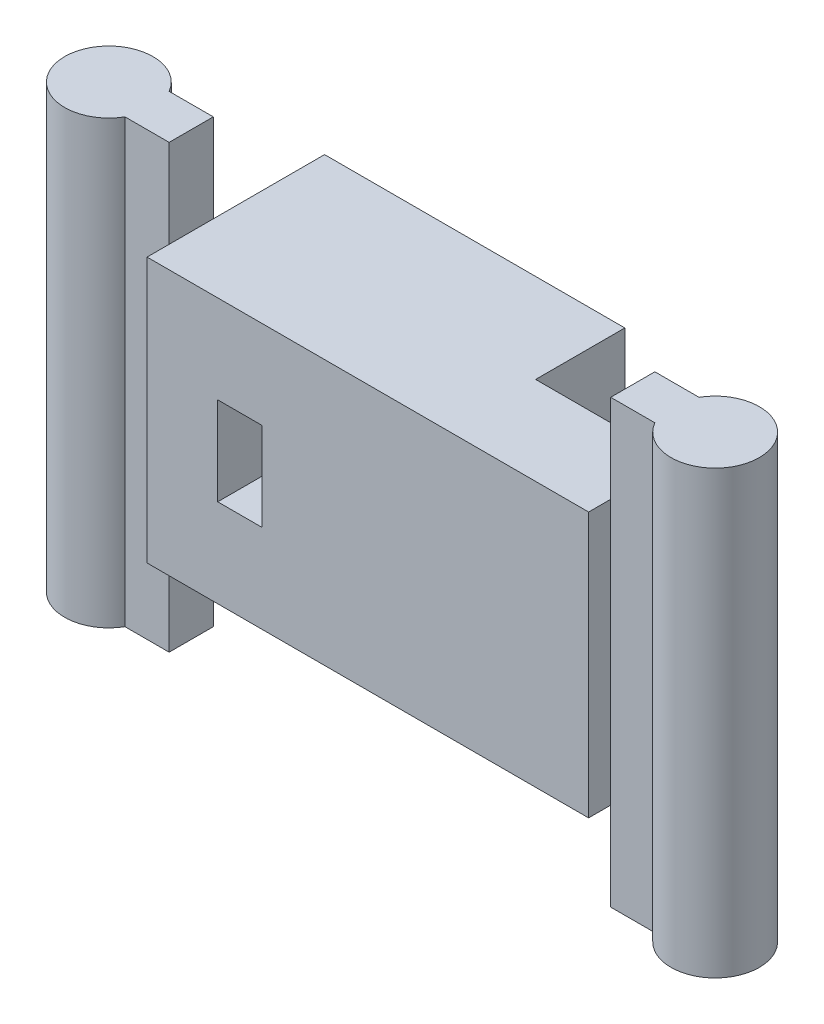
ISO-10303-21;
HEADER;
FILE_DESCRIPTION(('STEP AP214'),'2;1');
FILE_NAME('part.step','',(''),(''),'','','');
FILE_SCHEMA(('AUTOMOTIVE_DESIGN { 1 0 10303 214 1 1 1 1 }'));
ENDSEC;
DATA;
#1=APPLICATION_CONTEXT('core data for automotive mechanical design processes');
#2=APPLICATION_PROTOCOL_DEFINITION('international standard','automotive_design',2000,#1);
#3=PRODUCT_CONTEXT('',#1,'mechanical');
#4=PRODUCT('Part','Part','',(#3));
#5=PRODUCT_RELATED_PRODUCT_CATEGORY('part','',(#4));
#6=PRODUCT_DEFINITION_FORMATION('','',#4);
#7=PRODUCT_DEFINITION_CONTEXT('part definition',#1,'design');
#8=PRODUCT_DEFINITION('design','',#6,#7);
#9=PRODUCT_DEFINITION_SHAPE('','',#8);
#10=(LENGTH_UNIT() NAMED_UNIT(*) SI_UNIT(.MILLI.,.METRE.));
#11=(NAMED_UNIT(*) PLANE_ANGLE_UNIT() SI_UNIT($,.RADIAN.));
#12=(NAMED_UNIT(*) SI_UNIT($,.STERADIAN.) SOLID_ANGLE_UNIT());
#13=UNCERTAINTY_MEASURE_WITH_UNIT(LENGTH_MEASURE(1.E-05),#10,'distance_accuracy_value','');
#14=(GEOMETRIC_REPRESENTATION_CONTEXT(3) GLOBAL_UNCERTAINTY_ASSIGNED_CONTEXT((#13)) GLOBAL_UNIT_ASSIGNED_CONTEXT((#10,
#11,#12)) REPRESENTATION_CONTEXT('',''));
#15=CARTESIAN_POINT('',(0.,0.,0.));
#16=DIRECTION('',(0.,0.,1.));
#17=DIRECTION('',(1.,0.,0.));
#18=AXIS2_PLACEMENT_3D('',#15,#16,#17);
#19=CARTESIAN_POINT('',(-17.,-15.,20.1));
#20=DIRECTION('',(1.,0.,0.));
#21=DIRECTION('',(0.,0.,-1.));
#22=AXIS2_PLACEMENT_3D('',#19,#20,#21);
#23=PLANE('',#22);
#24=DIRECTION('',(0.,1.,0.));
#25=VECTOR('',#24,1.);
#26=CARTESIAN_POINT('',(-17.,-25.,17.6));
#27=LINE('',#26,#25);
#28=CARTESIAN_POINT('',(-17.,-15.,17.6));
#29=VERTEX_POINT('',#28);
#30=CARTESIAN_POINT('',(-17.,15.,17.6));
#31=VERTEX_POINT('',#30);
#32=EDGE_CURVE('E11',#29,#31,#27,.T.);
#33=ORIENTED_EDGE('',*,*,#32,.F.);
#34=DIRECTION('',(0.,0.,-1.));
#35=VECTOR('',#34,1.);
#36=CARTESIAN_POINT('',(-17.,-15.,20.1));
#37=LINE('',#36,#35);
#38=CARTESIAN_POINT('',(-17.,-15.,20.1));
#39=VERTEX_POINT('',#38);
#40=EDGE_CURVE('E345',#39,#29,#37,.T.);
#41=ORIENTED_EDGE('',*,*,#40,.F.);
#42=DIRECTION('',(0.,-1.,0.));
#43=VECTOR('',#42,1.);
#44=CARTESIAN_POINT('',(-17.,-15.,20.1));
#45=LINE('',#44,#43);
#46=CARTESIAN_POINT('',(-17.,15.,20.1));
#47=VERTEX_POINT('',#46);
#48=EDGE_CURVE('E327',#47,#39,#45,.T.);
#49=ORIENTED_EDGE('',*,*,#48,.F.);
#50=DIRECTION('',(0.,0.,-1.));
#51=VECTOR('',#50,1.);
#52=CARTESIAN_POINT('',(-17.,15.,20.1));
#53=LINE('',#52,#51);
#54=EDGE_CURVE('E349',#47,#31,#53,.T.);
#55=ORIENTED_EDGE('',*,*,#54,.T.);
#56=EDGE_LOOP('',(#33,#41,#49,#55));
#57=FACE_BOUND('',#56,.T.);
#58=ADVANCED_FACE('F37',(#57),#23,.F.);
#59=CARTESIAN_POINT('',(33.,0.,0.));
#60=DIRECTION('',(1.,0.,0.));
#61=DIRECTION('',(0.,0.,-1.));
#62=AXIS2_PLACEMENT_3D('',#59,#60,#61);
#63=PLANE('',#62);
#64=DIRECTION('',(0.,0.,-1.));
#65=VECTOR('',#64,1.);
#66=CARTESIAN_POINT('',(33.,-15.,20.1));
#67=LINE('',#66,#65);
#68=CARTESIAN_POINT('',(33.,-15.,20.1));
#69=VERTEX_POINT('',#68);
#70=CARTESIAN_POINT('',(33.,-15.,17.6));
#71=VERTEX_POINT('',#70);
#72=EDGE_CURVE('E274',#69,#71,#67,.T.);
#73=ORIENTED_EDGE('',*,*,#72,.T.);
#74=DIRECTION('',(0.,1.,0.));
#75=VECTOR('',#74,1.);
#76=CARTESIAN_POINT('',(33.,-25.,17.6));
#77=LINE('',#76,#75);
#78=CARTESIAN_POINT('',(33.,15.,17.6));
#79=VERTEX_POINT('',#78);
#80=EDGE_CURVE('E269',#71,#79,#77,.T.);
#81=ORIENTED_EDGE('',*,*,#80,.T.);
#82=DIRECTION('',(0.,0.,1.));
#83=VECTOR('',#82,1.);
#84=CARTESIAN_POINT('',(33.,15.,20.1));
#85=LINE('',#84,#83);
#86=CARTESIAN_POINT('',(33.,15.,20.1));
#87=VERTEX_POINT('',#86);
#88=EDGE_CURVE('E280',#79,#87,#85,.T.);
#89=ORIENTED_EDGE('',*,*,#88,.T.);
#90=DIRECTION('',(0.,-1.,0.));
#91=VECTOR('',#90,1.);
#92=CARTESIAN_POINT('',(33.,15.,20.1));
#93=LINE('',#92,#91);
#94=EDGE_CURVE('E270',#87,#69,#93,.T.);
#95=ORIENTED_EDGE('',*,*,#94,.T.);
#96=EDGE_LOOP('',(#73,#81,#89,#95));
#97=FACE_BOUND('',#96,.T.);
#98=ADVANCED_FACE('F426',(#97),#63,.T.);
#99=CARTESIAN_POINT('',(17.,-15.,20.1));
#100=DIRECTION('',(-1.,0.,0.));
#101=DIRECTION('',(0.,0.,1.));
#102=AXIS2_PLACEMENT_3D('',#99,#100,#101);
#103=PLANE('',#102);
#104=DIRECTION('',(0.,1.,0.));
#105=VECTOR('',#104,1.);
#106=CARTESIAN_POINT('',(17.,15.,10.1));
#107=LINE('',#106,#105);
#108=CARTESIAN_POINT('',(17.,-15.,10.1));
#109=VERTEX_POINT('',#108);
#110=CARTESIAN_POINT('',(17.,15.,10.1));
#111=VERTEX_POINT('',#110);
#112=EDGE_CURVE('E259',#109,#111,#107,.T.);
#113=ORIENTED_EDGE('',*,*,#112,.F.);
#114=DIRECTION('',(0.,0.,-1.));
#115=VECTOR('',#114,1.);
#116=CARTESIAN_POINT('',(17.,-15.,20.1));
#117=LINE('',#116,#115);
#118=CARTESIAN_POINT('',(17.,-15.,0.));
#119=VERTEX_POINT('',#118);
#120=EDGE_CURVE('E332',#109,#119,#117,.T.);
#121=ORIENTED_EDGE('',*,*,#120,.T.);
#122=DIRECTION('',(0.,1.,0.));
#123=VECTOR('',#122,1.);
#124=CARTESIAN_POINT('',(17.,-15.,0.));
#125=LINE('',#124,#123);
#126=CARTESIAN_POINT('',(17.,15.,0.));
#127=VERTEX_POINT('',#126);
#128=EDGE_CURVE('E324',#119,#127,#125,.T.);
#129=ORIENTED_EDGE('',*,*,#128,.T.);
#130=DIRECTION('',(0.,0.,-1.));
#131=VECTOR('',#130,1.);
#132=CARTESIAN_POINT('',(17.,15.,20.1));
#133=LINE('',#132,#131);
#134=EDGE_CURVE('E41',#111,#127,#133,.T.);
#135=ORIENTED_EDGE('',*,*,#134,.F.);
#136=EDGE_LOOP('',(#113,#121,#129,#135));
#137=FACE_BOUND('',#136,.T.);
#138=ADVANCED_FACE('F39',(#137),#103,.F.);
#139=CARTESIAN_POINT('',(0.,0.,20.1));
#140=DIRECTION('',(0.,0.,-1.));
#141=DIRECTION('',(-1.,0.,0.));
#142=AXIS2_PLACEMENT_3D('',#139,#140,#141);
#143=PLANE('',#142);
#144=DIRECTION('',(1.,0.,0.));
#145=VECTOR('',#144,1.);
#146=CARTESIAN_POINT('',(-17.,-15.,20.1));
#147=LINE('',#146,#145);
#148=EDGE_CURVE('E330',#39,#69,#147,.T.);
#149=ORIENTED_EDGE('',*,*,#148,.T.);
#150=ORIENTED_EDGE('',*,*,#94,.F.);
#151=DIRECTION('',(-1.,0.,0.));
#152=VECTOR('',#151,1.);
#153=CARTESIAN_POINT('',(-17.,15.,20.1));
#154=LINE('',#153,#152);
#155=EDGE_CURVE('E325',#87,#47,#154,.T.);
#156=ORIENTED_EDGE('',*,*,#155,.T.);
#157=ORIENTED_EDGE('',*,*,#48,.T.);
#158=EDGE_LOOP('',(#149,#150,#156,#157));
#159=FACE_BOUND('',#158,.T.);
#160=DIRECTION('',(0.,-1.,0.));
#161=VECTOR('',#160,1.);
#162=CARTESIAN_POINT('',(-9.,-5.,20.1));
#163=LINE('',#162,#161);
#164=CARTESIAN_POINT('',(-9.,5.,20.1));
#165=VERTEX_POINT('',#164);
#166=CARTESIAN_POINT('',(-9.,-5.,20.1));
#167=VERTEX_POINT('',#166);
#168=EDGE_CURVE('E294',#165,#167,#163,.T.);
#169=ORIENTED_EDGE('',*,*,#168,.F.);
#170=DIRECTION('',(-1.,0.,0.));
#171=VECTOR('',#170,1.);
#172=CARTESIAN_POINT('',(-4.,5.,20.1));
#173=LINE('',#172,#171);
#174=CARTESIAN_POINT('',(-4.,5.,20.1));
#175=VERTEX_POINT('',#174);
#176=EDGE_CURVE('E302',#175,#165,#173,.T.);
#177=ORIENTED_EDGE('',*,*,#176,.F.);
#178=DIRECTION('',(0.,1.,0.));
#179=VECTOR('',#178,1.);
#180=CARTESIAN_POINT('',(-4.,-5.,20.1));
#181=LINE('',#180,#179);
#182=CARTESIAN_POINT('',(-4.,-5.,20.1));
#183=VERTEX_POINT('',#182);
#184=EDGE_CURVE('E299',#183,#175,#181,.T.);
#185=ORIENTED_EDGE('',*,*,#184,.F.);
#186=DIRECTION('',(1.,0.,0.));
#187=VECTOR('',#186,1.);
#188=CARTESIAN_POINT('',(-4.,-5.,20.1));
#189=LINE('',#188,#187);
#190=EDGE_CURVE('E296',#167,#183,#189,.T.);
#191=ORIENTED_EDGE('',*,*,#190,.F.);
#192=EDGE_LOOP('',(#169,#177,#185,#191));
#193=FACE_BOUND('',#192,.T.);
#194=ADVANCED_FACE('F384',(#159,#193),#143,.F.);
#195=CARTESIAN_POINT('',(0.,0.,0.));
#196=DIRECTION('',(0.,0.,-1.));
#197=DIRECTION('',(-1.,0.,0.));
#198=AXIS2_PLACEMENT_3D('',#195,#196,#197);
#199=PLANE('',#198);
#200=ORIENTED_EDGE('',*,*,#128,.F.);
#201=DIRECTION('',(1.,0.,0.));
#202=VECTOR('',#201,1.);
#203=CARTESIAN_POINT('',(-17.,-15.,0.));
#204=LINE('',#203,#202);
#205=CARTESIAN_POINT('',(-17.,-15.,0.));
#206=VERTEX_POINT('',#205);
#207=EDGE_CURVE('E328',#206,#119,#204,.T.);
#208=ORIENTED_EDGE('',*,*,#207,.F.);
#209=DIRECTION('',(0.,-1.,0.));
#210=VECTOR('',#209,1.);
#211=CARTESIAN_POINT('',(-17.,-15.,0.));
#212=LINE('',#211,#210);
#213=CARTESIAN_POINT('',(-17.,15.,0.));
#214=VERTEX_POINT('',#213);
#215=EDGE_CURVE('E338',#214,#206,#212,.T.);
#216=ORIENTED_EDGE('',*,*,#215,.F.);
#217=DIRECTION('',(-1.,0.,0.));
#218=VECTOR('',#217,1.);
#219=CARTESIAN_POINT('',(-17.,15.,0.));
#220=LINE('',#219,#218);
#221=EDGE_CURVE('E335',#127,#214,#220,.T.);
#222=ORIENTED_EDGE('',*,*,#221,.F.);
#223=EDGE_LOOP('',(#200,#208,#216,#222));
#224=FACE_BOUND('',#223,.T.);
#225=DIRECTION('',(-1.,0.,0.));
#226=VECTOR('',#225,1.);
#227=CARTESIAN_POINT('',(-4.,5.,0.));
#228=LINE('',#227,#226);
#229=CARTESIAN_POINT('',(-4.,5.,0.));
#230=VERTEX_POINT('',#229);
#231=CARTESIAN_POINT('',(-9.,5.,0.));
#232=VERTEX_POINT('',#231);
#233=EDGE_CURVE('E297',#230,#232,#228,.T.);
#234=ORIENTED_EDGE('',*,*,#233,.T.);
#235=DIRECTION('',(0.,-1.,0.));
#236=VECTOR('',#235,1.);
#237=CARTESIAN_POINT('',(-9.,-5.,0.));
#238=LINE('',#237,#236);
#239=CARTESIAN_POINT('',(-9.,-5.,0.));
#240=VERTEX_POINT('',#239);
#241=EDGE_CURVE('E293',#232,#240,#238,.T.);
#242=ORIENTED_EDGE('',*,*,#241,.T.);
#243=DIRECTION('',(1.,0.,0.));
#244=VECTOR('',#243,1.);
#245=CARTESIAN_POINT('',(-4.,-5.,0.));
#246=LINE('',#245,#244);
#247=CARTESIAN_POINT('',(-4.,-5.,0.));
#248=VERTEX_POINT('',#247);
#249=EDGE_CURVE('E307',#240,#248,#246,.T.);
#250=ORIENTED_EDGE('',*,*,#249,.T.);
#251=DIRECTION('',(0.,1.,0.));
#252=VECTOR('',#251,1.);
#253=CARTESIAN_POINT('',(-4.,-5.,0.));
#254=LINE('',#253,#252);
#255=EDGE_CURVE('E310',#248,#230,#254,.T.);
#256=ORIENTED_EDGE('',*,*,#255,.T.);
#257=EDGE_LOOP('',(#234,#242,#250,#256));
#258=FACE_BOUND('',#257,.T.);
#259=ADVANCED_FACE('F369',(#224,#258),#199,.T.);
#260=CARTESIAN_POINT('',(-17.,15.,20.1));
#261=DIRECTION('',(0.,-1.,0.));
#262=DIRECTION('',(0.,0.,-1.));
#263=AXIS2_PLACEMENT_3D('',#260,#261,#262);
#264=PLANE('',#263);
#265=ORIENTED_EDGE('',*,*,#221,.T.);
#266=CARTESIAN_POINT('',(-17.,15.,12.6));
#267=VERTEX_POINT('',#266);
#268=EDGE_CURVE('E347',#267,#214,#53,.T.);
#269=ORIENTED_EDGE('',*,*,#268,.F.);
#270=EDGE_CURVE('E351',#31,#267,#53,.T.);
#271=ORIENTED_EDGE('',*,*,#270,.F.);
#272=ORIENTED_EDGE('',*,*,#54,.F.);
#273=ORIENTED_EDGE('',*,*,#155,.F.);
#274=ORIENTED_EDGE('',*,*,#88,.F.);
#275=CARTESIAN_POINT('',(33.,15.,12.6));
#276=VERTEX_POINT('',#275);
#277=EDGE_CURVE('E285',#276,#79,#85,.T.);
#278=ORIENTED_EDGE('',*,*,#277,.F.);
#279=CARTESIAN_POINT('',(33.,15.,10.1));
#280=VERTEX_POINT('',#279);
#281=EDGE_CURVE('E281',#280,#276,#85,.T.);
#282=ORIENTED_EDGE('',*,*,#281,.F.);
#283=DIRECTION('',(-1.,0.,0.));
#284=VECTOR('',#283,1.);
#285=CARTESIAN_POINT('',(33.,15.,10.1));
#286=LINE('',#285,#284);
#287=EDGE_CURVE('E284',#280,#111,#286,.T.);
#288=ORIENTED_EDGE('',*,*,#287,.T.);
#289=ORIENTED_EDGE('',*,*,#134,.T.);
#290=EDGE_LOOP('',(#265,#269,#271,#272,#273,#274,#278,#282,#288,#289));
#291=FACE_BOUND('',#290,.T.);
#292=ADVANCED_FACE('F366',(#291),#264,.F.);
#293=CARTESIAN_POINT('',(-17.,-15.,12.6));
#294=VERTEX_POINT('',#293);
#295=EDGE_CURVE('E344',#294,#206,#37,.T.);
#296=ORIENTED_EDGE('',*,*,#295,.F.);
#297=DIRECTION('',(0.,1.,0.));
#298=VECTOR('',#297,1.);
#299=CARTESIAN_POINT('',(-17.,-25.,12.6));
#300=LINE('',#299,#298);
#301=EDGE_CURVE('E46',#294,#267,#300,.T.);
#302=ORIENTED_EDGE('',*,*,#301,.T.);
#303=ORIENTED_EDGE('',*,*,#268,.T.);
#304=ORIENTED_EDGE('',*,*,#215,.T.);
#305=EDGE_LOOP('',(#296,#302,#303,#304));
#306=FACE_BOUND('',#305,.T.);
#307=ADVANCED_FACE('F360',(#306),#23,.F.);
#308=CARTESIAN_POINT('',(-17.,-15.,20.1));
#309=DIRECTION('',(0.,1.,0.));
#310=DIRECTION('',(0.,0.,1.));
#311=AXIS2_PLACEMENT_3D('',#308,#309,#310);
#312=PLANE('',#311);
#313=ORIENTED_EDGE('',*,*,#207,.T.);
#314=ORIENTED_EDGE('',*,*,#120,.F.);
#315=DIRECTION('',(-1.,0.,0.));
#316=VECTOR('',#315,1.);
#317=CARTESIAN_POINT('',(33.,-15.,10.1));
#318=LINE('',#317,#316);
#319=CARTESIAN_POINT('',(33.,-15.,10.1));
#320=VERTEX_POINT('',#319);
#321=EDGE_CURVE('E290',#320,#109,#318,.T.);
#322=ORIENTED_EDGE('',*,*,#321,.F.);
#323=CARTESIAN_POINT('',(33.,-15.,12.6));
#324=VERTEX_POINT('',#323);
#325=EDGE_CURVE('E273',#324,#320,#67,.T.);
#326=ORIENTED_EDGE('',*,*,#325,.F.);
#327=EDGE_CURVE('E278',#71,#324,#67,.T.);
#328=ORIENTED_EDGE('',*,*,#327,.F.);
#329=ORIENTED_EDGE('',*,*,#72,.F.);
#330=ORIENTED_EDGE('',*,*,#148,.F.);
#331=ORIENTED_EDGE('',*,*,#40,.T.);
#332=EDGE_CURVE('E348',#29,#294,#37,.T.);
#333=ORIENTED_EDGE('',*,*,#332,.T.);
#334=ORIENTED_EDGE('',*,*,#295,.T.);
#335=EDGE_LOOP('',(#313,#314,#322,#326,#328,#329,#330,#331,#333,#334));
#336=FACE_BOUND('',#335,.T.);
#337=ADVANCED_FACE('F373',(#336),#312,.F.);
#338=CARTESIAN_POINT('',(-9.,-5.,20.1));
#339=DIRECTION('',(1.,0.,0.));
#340=DIRECTION('',(0.,0.,-1.));
#341=AXIS2_PLACEMENT_3D('',#338,#339,#340);
#342=PLANE('',#341);
#343=ORIENTED_EDGE('',*,*,#241,.F.);
#344=DIRECTION('',(0.,0.,-1.));
#345=VECTOR('',#344,1.);
#346=CARTESIAN_POINT('',(-9.,5.,20.1));
#347=LINE('',#346,#345);
#348=EDGE_CURVE('E304',#165,#232,#347,.T.);
#349=ORIENTED_EDGE('',*,*,#348,.F.);
#350=ORIENTED_EDGE('',*,*,#168,.T.);
#351=DIRECTION('',(0.,0.,-1.));
#352=VECTOR('',#351,1.);
#353=CARTESIAN_POINT('',(-9.,-5.,20.1));
#354=LINE('',#353,#352);
#355=EDGE_CURVE('E321',#167,#240,#354,.T.);
#356=ORIENTED_EDGE('',*,*,#355,.T.);
#357=EDGE_LOOP('',(#343,#349,#350,#356));
#358=FACE_BOUND('',#357,.T.);
#359=ADVANCED_FACE('F449',(#358),#342,.T.);
#360=CARTESIAN_POINT('',(-4.,-5.,20.1));
#361=DIRECTION('',(0.,1.,0.));
#362=DIRECTION('',(0.,0.,1.));
#363=AXIS2_PLACEMENT_3D('',#360,#361,#362);
#364=PLANE('',#363);
#365=ORIENTED_EDGE('',*,*,#249,.F.);
#366=ORIENTED_EDGE('',*,*,#355,.F.);
#367=ORIENTED_EDGE('',*,*,#190,.T.);
#368=DIRECTION('',(0.,0.,-1.));
#369=VECTOR('',#368,1.);
#370=CARTESIAN_POINT('',(-4.,-5.,20.1));
#371=LINE('',#370,#369);
#372=EDGE_CURVE('E319',#183,#248,#371,.T.);
#373=ORIENTED_EDGE('',*,*,#372,.T.);
#374=EDGE_LOOP('',(#365,#366,#367,#373));
#375=FACE_BOUND('',#374,.T.);
#376=ADVANCED_FACE('F461',(#375),#364,.T.);
#377=CARTESIAN_POINT('',(-4.,-5.,20.1));
#378=DIRECTION('',(-1.,0.,0.));
#379=DIRECTION('',(0.,0.,1.));
#380=AXIS2_PLACEMENT_3D('',#377,#378,#379);
#381=PLANE('',#380);
#382=ORIENTED_EDGE('',*,*,#255,.F.);
#383=ORIENTED_EDGE('',*,*,#372,.F.);
#384=ORIENTED_EDGE('',*,*,#184,.T.);
#385=DIRECTION('',(0.,0.,-1.));
#386=VECTOR('',#385,1.);
#387=CARTESIAN_POINT('',(-4.,5.,20.1));
#388=LINE('',#387,#386);
#389=EDGE_CURVE('E317',#175,#230,#388,.T.);
#390=ORIENTED_EDGE('',*,*,#389,.T.);
#391=EDGE_LOOP('',(#382,#383,#384,#390));
#392=FACE_BOUND('',#391,.T.);
#393=ADVANCED_FACE('F465',(#392),#381,.T.);
#394=CARTESIAN_POINT('',(-4.,5.,20.1));
#395=DIRECTION('',(0.,-1.,0.));
#396=DIRECTION('',(0.,0.,-1.));
#397=AXIS2_PLACEMENT_3D('',#394,#395,#396);
#398=PLANE('',#397);
#399=ORIENTED_EDGE('',*,*,#233,.F.);
#400=ORIENTED_EDGE('',*,*,#389,.F.);
#401=ORIENTED_EDGE('',*,*,#176,.T.);
#402=ORIENTED_EDGE('',*,*,#348,.T.);
#403=EDGE_LOOP('',(#399,#400,#401,#402));
#404=FACE_BOUND('',#403,.T.);
#405=ADVANCED_FACE('F469',(#404),#398,.T.);
#406=CARTESIAN_POINT('',(33.,15.,10.1));
#407=DIRECTION('',(0.,0.,1.));
#408=DIRECTION('',(0.,-1.,0.));
#409=AXIS2_PLACEMENT_3D('',#406,#407,#408);
#410=PLANE('',#409);
#411=ORIENTED_EDGE('',*,*,#112,.T.);
#412=ORIENTED_EDGE('',*,*,#287,.F.);
#413=DIRECTION('',(0.,1.,0.));
#414=VECTOR('',#413,1.);
#415=CARTESIAN_POINT('',(33.,15.,10.1));
#416=LINE('',#415,#414);
#417=EDGE_CURVE('E277',#320,#280,#416,.T.);
#418=ORIENTED_EDGE('',*,*,#417,.F.);
#419=ORIENTED_EDGE('',*,*,#321,.T.);
#420=EDGE_LOOP('',(#411,#412,#418,#419));
#421=FACE_BOUND('',#420,.T.);
#422=ADVANCED_FACE('F423',(#421),#410,.F.);
#423=DIRECTION('',(0.,1.,0.));
#424=VECTOR('',#423,1.);
#425=CARTESIAN_POINT('',(33.,-25.,12.6));
#426=LINE('',#425,#424);
#427=EDGE_CURVE('E261',#324,#276,#426,.T.);
#428=ORIENTED_EDGE('',*,*,#427,.F.);
#429=ORIENTED_EDGE('',*,*,#325,.T.);
#430=ORIENTED_EDGE('',*,*,#417,.T.);
#431=ORIENTED_EDGE('',*,*,#281,.T.);
#432=EDGE_LOOP('',(#428,#429,#430,#431));
#433=FACE_BOUND('',#432,.T.);
#434=ADVANCED_FACE('F419',(#433),#63,.T.);
#435=CARTESIAN_POINT('',(33.,-25.,12.6));
#436=DIRECTION('',(-1.,0.,0.));
#437=DIRECTION('',(0.,0.,1.));
#438=AXIS2_PLACEMENT_3D('',#435,#436,#437);
#439=PLANE('',#438);
#440=CARTESIAN_POINT('',(33.,-25.,17.6));
#441=VERTEX_POINT('',#440);
#442=EDGE_CURVE('E266',#441,#71,#77,.T.);
#443=ORIENTED_EDGE('',*,*,#442,.T.);
#444=ORIENTED_EDGE('',*,*,#327,.T.);
#445=CARTESIAN_POINT('',(33.,-25.,12.6));
#446=VERTEX_POINT('',#445);
#447=EDGE_CURVE('E256',#446,#324,#426,.T.);
#448=ORIENTED_EDGE('',*,*,#447,.F.);
#449=DIRECTION('',(0.,0.,1.));
#450=VECTOR('',#449,1.);
#451=CARTESIAN_POINT('',(33.,-25.,12.6));
#452=LINE('',#451,#450);
#453=EDGE_CURVE('E233',#446,#441,#452,.T.);
#454=ORIENTED_EDGE('',*,*,#453,.T.);
#455=EDGE_LOOP('',(#443,#444,#448,#454));
#456=FACE_BOUND('',#455,.T.);
#457=ADVANCED_FACE('F416',(#456),#439,.T.);
#458=CARTESIAN_POINT('',(33.,25.,12.6));
#459=VERTEX_POINT('',#458);
#460=EDGE_CURVE('E260',#276,#459,#426,.T.);
#461=ORIENTED_EDGE('',*,*,#460,.F.);
#462=ORIENTED_EDGE('',*,*,#277,.T.);
#463=CARTESIAN_POINT('',(33.,25.,17.6));
#464=VERTEX_POINT('',#463);
#465=EDGE_CURVE('E64',#79,#464,#77,.T.);
#466=ORIENTED_EDGE('',*,*,#465,.T.);
#467=DIRECTION('',(0.,0.,1.));
#468=VECTOR('',#467,1.);
#469=CARTESIAN_POINT('',(33.,25.,12.6));
#470=LINE('',#469,#468);
#471=EDGE_CURVE('E229',#459,#464,#470,.T.);
#472=ORIENTED_EDGE('',*,*,#471,.F.);
#473=EDGE_LOOP('',(#461,#462,#466,#472));
#474=FACE_BOUND('',#473,.T.);
#475=ADVANCED_FACE('F403',(#474),#439,.T.);
#476=CARTESIAN_POINT('',(33.,-25.,12.6));
#477=DIRECTION('',(0.,0.,-1.));
#478=DIRECTION('',(-1.,0.,0.));
#479=AXIS2_PLACEMENT_3D('',#476,#477,#478);
#480=PLANE('',#479);
#481=DIRECTION('',(-1.,0.,0.));
#482=VECTOR('',#481,1.);
#483=CARTESIAN_POINT('',(33.,25.,12.6));
#484=LINE('',#483,#482);
#485=CARTESIAN_POINT('',(38.,25.,12.6));
#486=VERTEX_POINT('',#485);
#487=EDGE_CURVE('E237',#486,#459,#484,.T.);
#488=ORIENTED_EDGE('',*,*,#487,.F.);
#489=DIRECTION('',(0.,1.,0.));
#490=VECTOR('',#489,1.);
#491=CARTESIAN_POINT('',(38.,-25.,12.6));
#492=LINE('',#491,#490);
#493=CARTESIAN_POINT('',(38.,-25.,12.6));
#494=VERTEX_POINT('',#493);
#495=EDGE_CURVE('E262',#494,#486,#492,.T.);
#496=ORIENTED_EDGE('',*,*,#495,.F.);
#497=DIRECTION('',(-1.,0.,0.));
#498=VECTOR('',#497,1.);
#499=CARTESIAN_POINT('',(33.,-25.,12.6));
#500=LINE('',#499,#498);
#501=EDGE_CURVE('E243',#494,#446,#500,.T.);
#502=ORIENTED_EDGE('',*,*,#501,.T.);
#503=ORIENTED_EDGE('',*,*,#447,.T.);
#504=ORIENTED_EDGE('',*,*,#427,.T.);
#505=ORIENTED_EDGE('',*,*,#460,.T.);
#506=EDGE_LOOP('',(#488,#496,#502,#503,#504,#505));
#507=FACE_BOUND('',#506,.T.);
#508=ADVANCED_FACE('F401',(#507),#480,.T.);
#509=CARTESIAN_POINT('',(42.3301270189222,-25.,15.1));
#510=DIRECTION('',(0.,1.,0.));
#511=DIRECTION('',(0.,0.,1.));
#512=AXIS2_PLACEMENT_3D('',#509,#510,#511);
#513=CYLINDRICAL_SURFACE('',#512,5.);
#514=CARTESIAN_POINT('',(42.3301270189222,25.,15.1));
#515=DIRECTION('',(0.,1.,0.));
#516=DIRECTION('',(0.,0.,1.));
#517=AXIS2_PLACEMENT_3D('',#514,#515,#516);
#518=CIRCLE('',#517,5.);
#519=CARTESIAN_POINT('',(38.,25.,17.6));
#520=VERTEX_POINT('',#519);
#521=EDGE_CURVE('E251',#520,#486,#518,.T.);
#522=ORIENTED_EDGE('',*,*,#521,.F.);
#523=DIRECTION('',(0.,1.,0.));
#524=VECTOR('',#523,1.);
#525=CARTESIAN_POINT('',(38.,-25.,17.6));
#526=LINE('',#525,#524);
#527=CARTESIAN_POINT('',(38.,-25.,17.6));
#528=VERTEX_POINT('',#527);
#529=EDGE_CURVE('E264',#528,#520,#526,.T.);
#530=ORIENTED_EDGE('',*,*,#529,.F.);
#531=CARTESIAN_POINT('',(42.3301270189222,-25.,15.1));
#532=DIRECTION('',(0.,1.,0.));
#533=DIRECTION('',(0.,0.,1.));
#534=AXIS2_PLACEMENT_3D('',#531,#532,#533);
#535=CIRCLE('',#534,5.);
#536=EDGE_CURVE('E240',#528,#494,#535,.T.);
#537=ORIENTED_EDGE('',*,*,#536,.T.);
#538=ORIENTED_EDGE('',*,*,#495,.T.);
#539=EDGE_LOOP('',(#522,#530,#537,#538));
#540=FACE_BOUND('',#539,.T.);
#541=ADVANCED_FACE('F408',(#540),#513,.T.);
#542=CARTESIAN_POINT('',(33.,-25.,17.6));
#543=DIRECTION('',(0.,0.,1.));
#544=DIRECTION('',(1.,0.,0.));
#545=AXIS2_PLACEMENT_3D('',#542,#543,#544);
#546=PLANE('',#545);
#547=DIRECTION('',(1.,0.,0.));
#548=VECTOR('',#547,1.);
#549=CARTESIAN_POINT('',(33.,25.,17.6));
#550=LINE('',#549,#548);
#551=EDGE_CURVE('E248',#464,#520,#550,.T.);
#552=ORIENTED_EDGE('',*,*,#551,.F.);
#553=ORIENTED_EDGE('',*,*,#465,.F.);
#554=ORIENTED_EDGE('',*,*,#80,.F.);
#555=ORIENTED_EDGE('',*,*,#442,.F.);
#556=DIRECTION('',(1.,0.,0.));
#557=VECTOR('',#556,1.);
#558=CARTESIAN_POINT('',(33.,-25.,17.6));
#559=LINE('',#558,#557);
#560=EDGE_CURVE('E236',#441,#528,#559,.T.);
#561=ORIENTED_EDGE('',*,*,#560,.T.);
#562=ORIENTED_EDGE('',*,*,#529,.T.);
#563=EDGE_LOOP('',(#552,#553,#554,#555,#561,#562));
#564=FACE_BOUND('',#563,.T.);
#565=ADVANCED_FACE('F427',(#564),#546,.T.);
#566=CARTESIAN_POINT('',(42.3301270189222,-25.,15.1));
#567=DIRECTION('',(0.,1.,0.));
#568=DIRECTION('',(0.,0.,1.));
#569=AXIS2_PLACEMENT_3D('',#566,#567,#568);
#570=PLANE('',#569);
#571=ORIENTED_EDGE('',*,*,#453,.F.);
#572=ORIENTED_EDGE('',*,*,#501,.F.);
#573=ORIENTED_EDGE('',*,*,#536,.F.);
#574=ORIENTED_EDGE('',*,*,#560,.F.);
#575=EDGE_LOOP('',(#571,#572,#573,#574));
#576=FACE_BOUND('',#575,.T.);
#577=ADVANCED_FACE('F413',(#576),#570,.F.);
#578=CARTESIAN_POINT('',(42.3301270189222,25.,15.1));
#579=DIRECTION('',(0.,1.,0.));
#580=DIRECTION('',(0.,0.,1.));
#581=AXIS2_PLACEMENT_3D('',#578,#579,#580);
#582=PLANE('',#581);
#583=ORIENTED_EDGE('',*,*,#471,.T.);
#584=ORIENTED_EDGE('',*,*,#551,.T.);
#585=ORIENTED_EDGE('',*,*,#521,.T.);
#586=ORIENTED_EDGE('',*,*,#487,.T.);
#587=EDGE_LOOP('',(#583,#584,#585,#586));
#588=FACE_BOUND('',#587,.T.);
#589=ADVANCED_FACE('F405',(#588),#582,.T.);
#590=CARTESIAN_POINT('',(-17.,-25.,12.6));
#591=DIRECTION('',(1.,0.,0.));
#592=DIRECTION('',(0.,0.,-1.));
#593=AXIS2_PLACEMENT_3D('',#590,#591,#592);
#594=PLANE('',#593);
#595=ORIENTED_EDGE('',*,*,#332,.F.);
#596=CARTESIAN_POINT('',(-17.,-25.,17.6));
#597=VERTEX_POINT('',#596);
#598=EDGE_CURVE('E48',#597,#29,#27,.T.);
#599=ORIENTED_EDGE('',*,*,#598,.F.);
#600=DIRECTION('',(0.,0.,-1.));
#601=VECTOR('',#600,1.);
#602=CARTESIAN_POINT('',(-17.,-25.,12.6));
#603=LINE('',#602,#601);
#604=CARTESIAN_POINT('',(-17.,-25.,12.6));
#605=VERTEX_POINT('',#604);
#606=EDGE_CURVE('E211',#597,#605,#603,.T.);
#607=ORIENTED_EDGE('',*,*,#606,.T.);
#608=EDGE_CURVE('E230',#605,#294,#300,.T.);
#609=ORIENTED_EDGE('',*,*,#608,.T.);
#610=EDGE_LOOP('',(#595,#599,#607,#609));
#611=FACE_BOUND('',#610,.T.);
#612=ADVANCED_FACE('F379',(#611),#594,.T.);
#613=CARTESIAN_POINT('',(-26.3301270189222,-25.,15.1));
#614=DIRECTION('',(0.,1.,0.));
#615=DIRECTION('',(0.,0.,1.));
#616=AXIS2_PLACEMENT_3D('',#613,#614,#615);
#617=CYLINDRICAL_SURFACE('',#616,5.);
#618=CARTESIAN_POINT('',(-26.3301270189222,25.,15.1));
#619=DIRECTION('',(0.,1.,0.));
#620=DIRECTION('',(0.,0.,-1.));
#621=AXIS2_PLACEMENT_3D('',#618,#619,#620);
#622=CIRCLE('',#621,5.);
#623=CARTESIAN_POINT('',(-22.,25.,12.6));
#624=VERTEX_POINT('',#623);
#625=CARTESIAN_POINT('',(-22.,25.,17.6));
#626=VERTEX_POINT('',#625);
#627=EDGE_CURVE('E223',#624,#626,#622,.T.);
#628=ORIENTED_EDGE('',*,*,#627,.F.);
#629=DIRECTION('',(0.,1.,0.));
#630=VECTOR('',#629,1.);
#631=CARTESIAN_POINT('',(-22.,-25.,12.6));
#632=LINE('',#631,#630);
#633=CARTESIAN_POINT('',(-22.,-25.,12.6));
#634=VERTEX_POINT('',#633);
#635=EDGE_CURVE('E214',#634,#624,#632,.T.);
#636=ORIENTED_EDGE('',*,*,#635,.F.);
#637=CARTESIAN_POINT('',(-26.3301270189222,-25.,15.1));
#638=DIRECTION('',(0.,1.,0.));
#639=DIRECTION('',(0.,0.,-1.));
#640=AXIS2_PLACEMENT_3D('',#637,#638,#639);
#641=CIRCLE('',#640,5.);
#642=CARTESIAN_POINT('',(-22.,-25.,17.6));
#643=VERTEX_POINT('',#642);
#644=EDGE_CURVE('E208',#634,#643,#641,.T.);
#645=ORIENTED_EDGE('',*,*,#644,.T.);
#646=DIRECTION('',(0.,1.,0.));
#647=VECTOR('',#646,1.);
#648=CARTESIAN_POINT('',(-22.,-25.,17.6));
#649=LINE('',#648,#647);
#650=EDGE_CURVE('E190',#643,#626,#649,.T.);
#651=ORIENTED_EDGE('',*,*,#650,.T.);
#652=EDGE_LOOP('',(#628,#636,#645,#651));
#653=FACE_BOUND('',#652,.T.);
#654=ADVANCED_FACE('F213',(#653),#617,.T.);
#655=CARTESIAN_POINT('',(-17.,-25.,12.6));
#656=DIRECTION('',(0.,0.,-1.));
#657=DIRECTION('',(-1.,0.,0.));
#658=AXIS2_PLACEMENT_3D('',#655,#656,#657);
#659=PLANE('',#658);
#660=DIRECTION('',(-1.,0.,0.));
#661=VECTOR('',#660,1.);
#662=CARTESIAN_POINT('',(-17.,25.,12.6));
#663=LINE('',#662,#661);
#664=CARTESIAN_POINT('',(-17.,25.,12.6));
#665=VERTEX_POINT('',#664);
#666=EDGE_CURVE('E215',#665,#624,#663,.T.);
#667=ORIENTED_EDGE('',*,*,#666,.F.);
#668=EDGE_CURVE('E56',#267,#665,#300,.T.);
#669=ORIENTED_EDGE('',*,*,#668,.F.);
#670=ORIENTED_EDGE('',*,*,#301,.F.);
#671=ORIENTED_EDGE('',*,*,#608,.F.);
#672=DIRECTION('',(-1.,0.,0.));
#673=VECTOR('',#672,1.);
#674=CARTESIAN_POINT('',(-17.,-25.,12.6));
#675=LINE('',#674,#673);
#676=EDGE_CURVE('E201',#605,#634,#675,.T.);
#677=ORIENTED_EDGE('',*,*,#676,.T.);
#678=ORIENTED_EDGE('',*,*,#635,.T.);
#679=EDGE_LOOP('',(#667,#669,#670,#671,#677,#678));
#680=FACE_BOUND('',#679,.T.);
#681=ADVANCED_FACE('F393',(#680),#659,.T.);
#682=CARTESIAN_POINT('',(-17.,25.,17.6));
#683=VERTEX_POINT('',#682);
#684=EDGE_CURVE('E49',#31,#683,#27,.T.);
#685=ORIENTED_EDGE('',*,*,#684,.F.);
#686=ORIENTED_EDGE('',*,*,#270,.T.);
#687=ORIENTED_EDGE('',*,*,#668,.T.);
#688=DIRECTION('',(0.,0.,-1.));
#689=VECTOR('',#688,1.);
#690=CARTESIAN_POINT('',(-17.,25.,12.6));
#691=LINE('',#690,#689);
#692=EDGE_CURVE('E218',#683,#665,#691,.T.);
#693=ORIENTED_EDGE('',*,*,#692,.F.);
#694=EDGE_LOOP('',(#685,#686,#687,#693));
#695=FACE_BOUND('',#694,.T.);
#696=ADVANCED_FACE('F389',(#695),#594,.T.);
#697=CARTESIAN_POINT('',(-17.,-25.,17.6));
#698=DIRECTION('',(0.,0.,1.));
#699=DIRECTION('',(1.,0.,0.));
#700=AXIS2_PLACEMENT_3D('',#697,#698,#699);
#701=PLANE('',#700);
#702=DIRECTION('',(1.,0.,0.));
#703=VECTOR('',#702,1.);
#704=CARTESIAN_POINT('',(-17.,25.,17.6));
#705=LINE('',#704,#703);
#706=EDGE_CURVE('E196',#626,#683,#705,.T.);
#707=ORIENTED_EDGE('',*,*,#706,.F.);
#708=ORIENTED_EDGE('',*,*,#650,.F.);
#709=DIRECTION('',(1.,0.,0.));
#710=VECTOR('',#709,1.);
#711=CARTESIAN_POINT('',(-17.,-25.,17.6));
#712=LINE('',#711,#710);
#713=EDGE_CURVE('E194',#643,#597,#712,.T.);
#714=ORIENTED_EDGE('',*,*,#713,.T.);
#715=ORIENTED_EDGE('',*,*,#598,.T.);
#716=ORIENTED_EDGE('',*,*,#32,.T.);
#717=ORIENTED_EDGE('',*,*,#684,.T.);
#718=EDGE_LOOP('',(#707,#708,#714,#715,#716,#717));
#719=FACE_BOUND('',#718,.T.);
#720=ADVANCED_FACE('F192',(#719),#701,.T.);
#721=CARTESIAN_POINT('',(-26.3301270189222,-25.,15.1));
#722=DIRECTION('',(0.,-1.,0.));
#723=DIRECTION('',(0.,0.,-1.));
#724=AXIS2_PLACEMENT_3D('',#721,#722,#723);
#725=PLANE('',#724);
#726=ORIENTED_EDGE('',*,*,#644,.F.);
#727=ORIENTED_EDGE('',*,*,#676,.F.);
#728=ORIENTED_EDGE('',*,*,#606,.F.);
#729=ORIENTED_EDGE('',*,*,#713,.F.);
#730=EDGE_LOOP('',(#726,#727,#728,#729));
#731=FACE_BOUND('',#730,.T.);
#732=ADVANCED_FACE('F206',(#731),#725,.T.);
#733=CARTESIAN_POINT('',(-26.3301270189222,25.,15.1));
#734=DIRECTION('',(0.,-1.,0.));
#735=DIRECTION('',(0.,0.,-1.));
#736=AXIS2_PLACEMENT_3D('',#733,#734,#735);
#737=PLANE('',#736);
#738=ORIENTED_EDGE('',*,*,#627,.T.);
#739=ORIENTED_EDGE('',*,*,#706,.T.);
#740=ORIENTED_EDGE('',*,*,#692,.T.);
#741=ORIENTED_EDGE('',*,*,#666,.T.);
#742=EDGE_LOOP('',(#738,#739,#740,#741));
#743=FACE_BOUND('',#742,.T.);
#744=ADVANCED_FACE('F392',(#743),#737,.F.);
#745=CLOSED_SHELL('',(#58,#98,#138,#194,#259,#292,#307,#337,#359,#376,#393,#405,#422,#434,#457,
#475,#508,#541,#565,#577,#589,#612,#654,#681,#696,#720,#732,#744));
#746=MANIFOLD_SOLID_BREP('B2',#745);
#747=ADVANCED_BREP_SHAPE_REPRESENTATION('',(#18,#746),#14);
#748=SHAPE_DEFINITION_REPRESENTATION(#9,#747);
ENDSEC;
END-ISO-10303-21;
